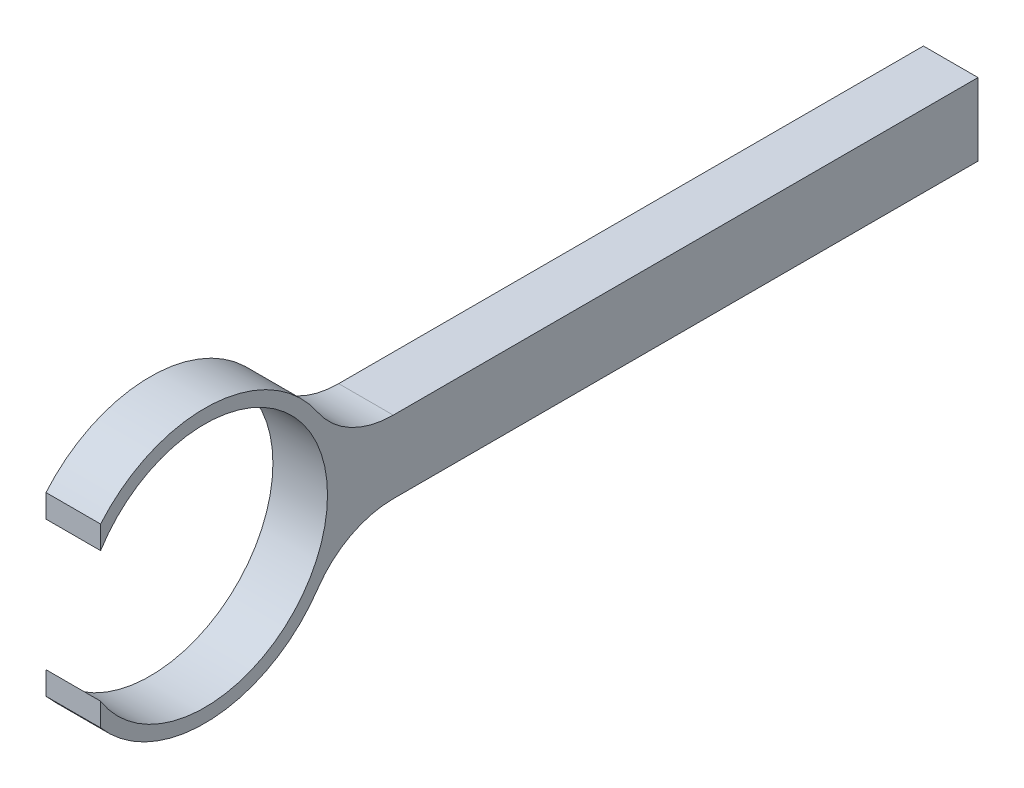
ISO-10303-21;
HEADER;
FILE_DESCRIPTION(('STEP AP214'),'2;1');
FILE_NAME('part.step','',(''),(''),'','','');
FILE_SCHEMA(('AUTOMOTIVE_DESIGN { 1 0 10303 214 1 1 1 1 }'));
ENDSEC;
DATA;
#1=APPLICATION_CONTEXT('core data for automotive mechanical design processes');
#2=APPLICATION_PROTOCOL_DEFINITION('international standard','automotive_design',2000,#1);
#3=PRODUCT_CONTEXT('',#1,'mechanical');
#4=PRODUCT('Part','Part','',(#3));
#5=PRODUCT_RELATED_PRODUCT_CATEGORY('part','',(#4));
#6=PRODUCT_DEFINITION_FORMATION('','',#4);
#7=PRODUCT_DEFINITION_CONTEXT('part definition',#1,'design');
#8=PRODUCT_DEFINITION('design','',#6,#7);
#9=PRODUCT_DEFINITION_SHAPE('','',#8);
#10=(LENGTH_UNIT() NAMED_UNIT(*) SI_UNIT(.MILLI.,.METRE.));
#11=(NAMED_UNIT(*) PLANE_ANGLE_UNIT() SI_UNIT($,.RADIAN.));
#12=(NAMED_UNIT(*) SI_UNIT($,.STERADIAN.) SOLID_ANGLE_UNIT());
#13=UNCERTAINTY_MEASURE_WITH_UNIT(LENGTH_MEASURE(1.E-05),#10,'distance_accuracy_value','');
#14=(GEOMETRIC_REPRESENTATION_CONTEXT(3) GLOBAL_UNCERTAINTY_ASSIGNED_CONTEXT((#13)) GLOBAL_UNIT_ASSIGNED_CONTEXT((#10,
#11,#12)) REPRESENTATION_CONTEXT('',''));
#15=CARTESIAN_POINT('',(0.,0.,0.));
#16=DIRECTION('',(0.,0.,1.));
#17=DIRECTION('',(1.,0.,0.));
#18=AXIS2_PLACEMENT_3D('',#15,#16,#17);
#19=CARTESIAN_POINT('',(6.,0.,0.));
#20=DIRECTION('',(-1.,0.,0.));
#21=DIRECTION('',(0.,0.,1.));
#22=AXIS2_PLACEMENT_3D('',#19,#20,#21);
#23=CYLINDRICAL_SURFACE('',#22,13.5);
#24=CARTESIAN_POINT('',(0.,0.,0.));
#25=DIRECTION('',(1.,0.,0.));
#26=DIRECTION('',(0.,0.,-1.));
#27=AXIS2_PLACEMENT_3D('',#24,#25,#26);
#28=CIRCLE('',#27,13.5);
#29=CARTESIAN_POINT('',(0.,-7.16348225812186,11.442662362299));
#30=VERTEX_POINT('',#29);
#31=CARTESIAN_POINT('',(0.,7.16348225812186,11.442662362299));
#32=VERTEX_POINT('',#31);
#33=EDGE_CURVE('E117',#30,#32,#28,.T.);
#34=ORIENTED_EDGE('',*,*,#33,.F.);
#35=DIRECTION('',(-1.,0.,0.));
#36=VECTOR('',#35,1.);
#37=CARTESIAN_POINT('',(6.,-7.16348225812186,11.442662362299));
#38=LINE('',#37,#36);
#39=CARTESIAN_POINT('',(6.,-7.16348225812186,11.442662362299));
#40=VERTEX_POINT('',#39);
#41=EDGE_CURVE('E112',#40,#30,#38,.T.);
#42=ORIENTED_EDGE('',*,*,#41,.F.);
#43=CARTESIAN_POINT('',(6.,0.,0.));
#44=DIRECTION('',(1.,0.,0.));
#45=DIRECTION('',(0.,0.,-1.));
#46=AXIS2_PLACEMENT_3D('',#43,#44,#45);
#47=CIRCLE('',#46,13.5);
#48=CARTESIAN_POINT('',(6.,7.16348225812186,11.442662362299));
#49=VERTEX_POINT('',#48);
#50=EDGE_CURVE('E115',#40,#49,#47,.T.);
#51=ORIENTED_EDGE('',*,*,#50,.T.);
#52=DIRECTION('',(-1.,0.,0.));
#53=VECTOR('',#52,1.);
#54=CARTESIAN_POINT('',(6.,7.16348225812186,11.442662362299));
#55=LINE('',#54,#53);
#56=EDGE_CURVE('E160',#49,#32,#55,.T.);
#57=ORIENTED_EDGE('',*,*,#56,.T.);
#58=EDGE_LOOP('',(#34,#42,#51,#57));
#59=FACE_BOUND('',#58,.T.);
#60=ADVANCED_FACE('F35',(#59),#23,.F.);
#61=CARTESIAN_POINT('',(6.,0.,11.442662362299));
#62=DIRECTION('',(0.,0.,-1.));
#63=DIRECTION('',(0.,1.,0.));
#64=AXIS2_PLACEMENT_3D('',#61,#62,#63);
#65=PLANE('',#64);
#66=DIRECTION('',(0.,-1.,0.));
#67=VECTOR('',#66,1.);
#68=CARTESIAN_POINT('',(0.,0.,11.442662362299));
#69=LINE('',#68,#67);
#70=CARTESIAN_POINT('',(0.,-9.69873590023085,11.442662362299));
#71=VERTEX_POINT('',#70);
#72=EDGE_CURVE('E139',#30,#71,#69,.T.);
#73=ORIENTED_EDGE('',*,*,#72,.T.);
#74=DIRECTION('',(-1.,0.,0.));
#75=VECTOR('',#74,1.);
#76=CARTESIAN_POINT('',(6.,-9.69873590023085,11.442662362299));
#77=LINE('',#76,#75);
#78=CARTESIAN_POINT('',(6.,-9.69873590023085,11.442662362299));
#79=VERTEX_POINT('',#78);
#80=EDGE_CURVE('E121',#79,#71,#77,.T.);
#81=ORIENTED_EDGE('',*,*,#80,.F.);
#82=DIRECTION('',(0.,-1.,0.));
#83=VECTOR('',#82,1.);
#84=CARTESIAN_POINT('',(6.,0.,11.442662362299));
#85=LINE('',#84,#83);
#86=EDGE_CURVE('E124',#40,#79,#85,.T.);
#87=ORIENTED_EDGE('',*,*,#86,.F.);
#88=ORIENTED_EDGE('',*,*,#41,.T.);
#89=EDGE_LOOP('',(#73,#81,#87,#88));
#90=FACE_BOUND('',#89,.T.);
#91=ADVANCED_FACE('F125',(#90),#65,.F.);
#92=CARTESIAN_POINT('',(6.,0.,0.));
#93=DIRECTION('',(-1.,0.,0.));
#94=DIRECTION('',(0.,0.,1.));
#95=AXIS2_PLACEMENT_3D('',#92,#93,#94);
#96=CYLINDRICAL_SURFACE('',#95,15.);
#97=CARTESIAN_POINT('',(0.,0.,0.));
#98=DIRECTION('',(1.,0.,0.));
#99=DIRECTION('',(0.,0.,-1.));
#100=AXIS2_PLACEMENT_3D('',#97,#98,#99);
#101=CIRCLE('',#100,15.);
#102=CARTESIAN_POINT('',(0.,-8.3880894821815,-12.435431429545));
#103=VERTEX_POINT('',#102);
#104=EDGE_CURVE('E151',#71,#103,#101,.T.);
#105=ORIENTED_EDGE('',*,*,#104,.T.);
#106=DIRECTION('',(-1.,0.,0.));
#107=VECTOR('',#106,1.);
#108=CARTESIAN_POINT('',(6.,-8.3880894821815,-12.435431429545));
#109=LINE('',#108,#107);
#110=CARTESIAN_POINT('',(6.,-8.3880894821815,-12.435431429545));
#111=VERTEX_POINT('',#110);
#112=EDGE_CURVE('E50',#103,#111,#109,.F.);
#113=ORIENTED_EDGE('',*,*,#112,.T.);
#114=CARTESIAN_POINT('',(6.,0.,0.));
#115=DIRECTION('',(1.,0.,0.));
#116=DIRECTION('',(0.,0.,-1.));
#117=AXIS2_PLACEMENT_3D('',#114,#115,#116);
#118=CIRCLE('',#117,15.);
#119=EDGE_CURVE('E128',#79,#111,#118,.T.);
#120=ORIENTED_EDGE('',*,*,#119,.F.);
#121=ORIENTED_EDGE('',*,*,#80,.T.);
#122=EDGE_LOOP('',(#105,#113,#120,#121));
#123=FACE_BOUND('',#122,.T.);
#124=ADVANCED_FACE('F211',(#123),#96,.T.);
#125=CARTESIAN_POINT('',(6.,-3.98014913696917,0.));
#126=DIRECTION('',(0.,1.,0.));
#127=DIRECTION('',(0.,0.,1.));
#128=AXIS2_PLACEMENT_3D('',#125,#126,#127);
#129=PLANE('',#128);
#130=DIRECTION('',(0.,0.,-1.));
#131=VECTOR('',#130,1.);
#132=CARTESIAN_POINT('',(6.,-3.98014913696917,0.));
#133=LINE('',#132,#131);
#134=CARTESIAN_POINT('',(6.,-3.98014913696917,-20.7257190492417));
#135=VERTEX_POINT('',#134);
#136=CARTESIAN_POINT('',(6.,-3.98014913696917,-85.));
#137=VERTEX_POINT('',#136);
#138=EDGE_CURVE('E142',#135,#137,#133,.T.);
#139=ORIENTED_EDGE('',*,*,#138,.F.);
#140=DIRECTION('',(1.,0.,0.));
#141=VECTOR('',#140,1.);
#142=CARTESIAN_POINT('',(0.,-3.98014913696917,-20.7257190492417));
#143=LINE('',#142,#141);
#144=CARTESIAN_POINT('',(0.,-3.98014913696917,-20.7257190492417));
#145=VERTEX_POINT('',#144);
#146=EDGE_CURVE('E176',#135,#145,#143,.F.);
#147=ORIENTED_EDGE('',*,*,#146,.T.);
#148=DIRECTION('',(0.,0.,-1.));
#149=VECTOR('',#148,1.);
#150=CARTESIAN_POINT('',(0.,-3.98014913696917,0.));
#151=LINE('',#150,#149);
#152=CARTESIAN_POINT('',(0.,-3.98014913696917,-85.));
#153=VERTEX_POINT('',#152);
#154=EDGE_CURVE('E153',#145,#153,#151,.T.);
#155=ORIENTED_EDGE('',*,*,#154,.T.);
#156=DIRECTION('',(-1.,0.,0.));
#157=VECTOR('',#156,1.);
#158=CARTESIAN_POINT('',(6.,-3.98014913696917,-85.));
#159=LINE('',#158,#157);
#160=EDGE_CURVE('E168',#137,#153,#159,.T.);
#161=ORIENTED_EDGE('',*,*,#160,.F.);
#162=EDGE_LOOP('',(#139,#147,#155,#161));
#163=FACE_BOUND('',#162,.T.);
#164=ADVANCED_FACE('F207',(#163),#129,.F.);
#165=CARTESIAN_POINT('',(6.,0.,-85.));
#166=DIRECTION('',(0.,0.,1.));
#167=DIRECTION('',(1.,0.,0.));
#168=AXIS2_PLACEMENT_3D('',#165,#166,#167);
#169=PLANE('',#168);
#170=DIRECTION('',(0.,1.,0.));
#171=VECTOR('',#170,1.);
#172=CARTESIAN_POINT('',(0.,0.,-85.));
#173=LINE('',#172,#171);
#174=CARTESIAN_POINT('',(0.,3.98014913696917,-85.));
#175=VERTEX_POINT('',#174);
#176=EDGE_CURVE('E155',#153,#175,#173,.T.);
#177=ORIENTED_EDGE('',*,*,#176,.T.);
#178=DIRECTION('',(-1.,0.,0.));
#179=VECTOR('',#178,1.);
#180=CARTESIAN_POINT('',(6.,3.98014913696917,-85.));
#181=LINE('',#180,#179);
#182=CARTESIAN_POINT('',(6.,3.98014913696917,-85.));
#183=VERTEX_POINT('',#182);
#184=EDGE_CURVE('E165',#183,#175,#181,.T.);
#185=ORIENTED_EDGE('',*,*,#184,.F.);
#186=DIRECTION('',(0.,1.,0.));
#187=VECTOR('',#186,1.);
#188=CARTESIAN_POINT('',(6.,0.,-85.));
#189=LINE('',#188,#187);
#190=EDGE_CURVE('E145',#137,#183,#189,.T.);
#191=ORIENTED_EDGE('',*,*,#190,.F.);
#192=ORIENTED_EDGE('',*,*,#160,.T.);
#193=EDGE_LOOP('',(#177,#185,#191,#192));
#194=FACE_BOUND('',#193,.T.);
#195=ADVANCED_FACE('F203',(#194),#169,.F.);
#196=CARTESIAN_POINT('',(6.,3.98014913696917,0.));
#197=DIRECTION('',(0.,1.,0.));
#198=DIRECTION('',(0.,0.,1.));
#199=AXIS2_PLACEMENT_3D('',#196,#197,#198);
#200=PLANE('',#199);
#201=DIRECTION('',(0.,0.,-1.));
#202=VECTOR('',#201,1.);
#203=CARTESIAN_POINT('',(0.,3.98014913696917,0.));
#204=LINE('',#203,#202);
#205=CARTESIAN_POINT('',(0.,3.98014913696917,-20.7257190492417));
#206=VERTEX_POINT('',#205);
#207=EDGE_CURVE('E158',#206,#175,#204,.T.);
#208=ORIENTED_EDGE('',*,*,#207,.F.);
#209=DIRECTION('',(-1.,0.,0.));
#210=VECTOR('',#209,1.);
#211=CARTESIAN_POINT('',(6.,3.98014913696917,-20.7257190492417));
#212=LINE('',#211,#210);
#213=CARTESIAN_POINT('',(6.,3.98014913696917,-20.7257190492417));
#214=VERTEX_POINT('',#213);
#215=EDGE_CURVE('E174',#206,#214,#212,.F.);
#216=ORIENTED_EDGE('',*,*,#215,.T.);
#217=DIRECTION('',(0.,0.,-1.));
#218=VECTOR('',#217,1.);
#219=CARTESIAN_POINT('',(6.,3.98014913696917,0.));
#220=LINE('',#219,#218);
#221=EDGE_CURVE('E148',#214,#183,#220,.T.);
#222=ORIENTED_EDGE('',*,*,#221,.T.);
#223=ORIENTED_EDGE('',*,*,#184,.T.);
#224=EDGE_LOOP('',(#208,#216,#222,#223));
#225=FACE_BOUND('',#224,.T.);
#226=ADVANCED_FACE('F199',(#225),#200,.T.);
#227=CARTESIAN_POINT('',(6.,8.3880894821815,-12.435431429545));
#228=VERTEX_POINT('',#227);
#229=CARTESIAN_POINT('',(6.,9.69873590023085,11.442662362299));
#230=VERTEX_POINT('',#229);
#231=EDGE_CURVE('E143',#228,#230,#118,.T.);
#232=ORIENTED_EDGE('',*,*,#231,.F.);
#233=DIRECTION('',(-1.,0.,0.));
#234=VECTOR('',#233,1.);
#235=CARTESIAN_POINT('',(6.,8.3880894821815,-12.435431429545));
#236=LINE('',#235,#234);
#237=CARTESIAN_POINT('',(0.,8.3880894821815,-12.435431429545));
#238=VERTEX_POINT('',#237);
#239=EDGE_CURVE('E120',#228,#238,#236,.T.);
#240=ORIENTED_EDGE('',*,*,#239,.T.);
#241=CARTESIAN_POINT('',(0.,9.69873590023085,11.442662362299));
#242=VERTEX_POINT('',#241);
#243=EDGE_CURVE('E137',#238,#242,#101,.T.);
#244=ORIENTED_EDGE('',*,*,#243,.T.);
#245=DIRECTION('',(-1.,0.,0.));
#246=VECTOR('',#245,1.);
#247=CARTESIAN_POINT('',(6.,9.69873590023085,11.442662362299));
#248=LINE('',#247,#246);
#249=EDGE_CURVE('E162',#230,#242,#248,.T.);
#250=ORIENTED_EDGE('',*,*,#249,.F.);
#251=EDGE_LOOP('',(#232,#240,#244,#250));
#252=FACE_BOUND('',#251,.T.);
#253=ADVANCED_FACE('F191',(#252),#96,.T.);
#254=EDGE_CURVE('E134',#242,#32,#69,.T.);
#255=ORIENTED_EDGE('',*,*,#254,.T.);
#256=ORIENTED_EDGE('',*,*,#56,.F.);
#257=EDGE_CURVE('E130',#230,#49,#85,.T.);
#258=ORIENTED_EDGE('',*,*,#257,.F.);
#259=ORIENTED_EDGE('',*,*,#249,.T.);
#260=EDGE_LOOP('',(#255,#256,#258,#259));
#261=FACE_BOUND('',#260,.T.);
#262=ADVANCED_FACE('F213',(#261),#65,.F.);
#263=CARTESIAN_POINT('',(6.,0.,0.));
#264=DIRECTION('',(1.,0.,0.));
#265=DIRECTION('',(0.,0.,-1.));
#266=AXIS2_PLACEMENT_3D('',#263,#264,#265);
#267=PLANE('',#266);
#268=ORIENTED_EDGE('',*,*,#50,.F.);
#269=ORIENTED_EDGE('',*,*,#86,.T.);
#270=ORIENTED_EDGE('',*,*,#119,.T.);
#271=CARTESIAN_POINT('',(6.,-13.9801491369692,-20.7257190492417));
#272=DIRECTION('',(1.,0.,0.));
#273=DIRECTION('',(0.,0.,-1.));
#274=AXIS2_PLACEMENT_3D('',#271,#272,#273);
#275=CIRCLE('',#274,10.);
#276=EDGE_CURVE('E11',#111,#135,#275,.F.);
#277=ORIENTED_EDGE('',*,*,#276,.T.);
#278=ORIENTED_EDGE('',*,*,#138,.T.);
#279=ORIENTED_EDGE('',*,*,#190,.T.);
#280=ORIENTED_EDGE('',*,*,#221,.F.);
#281=CARTESIAN_POINT('',(6.,13.9801491369692,-20.7257190492417));
#282=DIRECTION('',(1.,0.,0.));
#283=DIRECTION('',(0.,0.,-1.));
#284=AXIS2_PLACEMENT_3D('',#281,#282,#283);
#285=CIRCLE('',#284,10.);
#286=EDGE_CURVE('E182',#214,#228,#285,.F.);
#287=ORIENTED_EDGE('',*,*,#286,.T.);
#288=ORIENTED_EDGE('',*,*,#231,.T.);
#289=ORIENTED_EDGE('',*,*,#257,.T.);
#290=EDGE_LOOP('',(#268,#269,#270,#277,#278,#279,#280,#287,#288,#289));
#291=FACE_BOUND('',#290,.T.);
#292=ADVANCED_FACE('F131',(#291),#267,.T.);
#293=CARTESIAN_POINT('',(0.,0.,0.));
#294=DIRECTION('',(1.,0.,0.));
#295=DIRECTION('',(0.,0.,-1.));
#296=AXIS2_PLACEMENT_3D('',#293,#294,#295);
#297=PLANE('',#296);
#298=ORIENTED_EDGE('',*,*,#33,.T.);
#299=ORIENTED_EDGE('',*,*,#254,.F.);
#300=ORIENTED_EDGE('',*,*,#243,.F.);
#301=CARTESIAN_POINT('',(0.,13.9801491369692,-20.7257190492417));
#302=DIRECTION('',(1.,0.,0.));
#303=DIRECTION('',(0.,0.,-1.));
#304=AXIS2_PLACEMENT_3D('',#301,#302,#303);
#305=CIRCLE('',#304,10.);
#306=EDGE_CURVE('E180',#238,#206,#305,.T.);
#307=ORIENTED_EDGE('',*,*,#306,.T.);
#308=ORIENTED_EDGE('',*,*,#207,.T.);
#309=ORIENTED_EDGE('',*,*,#176,.F.);
#310=ORIENTED_EDGE('',*,*,#154,.F.);
#311=CARTESIAN_POINT('',(0.,-13.9801491369692,-20.7257190492417));
#312=DIRECTION('',(1.,0.,0.));
#313=DIRECTION('',(0.,0.,-1.));
#314=AXIS2_PLACEMENT_3D('',#311,#312,#313);
#315=CIRCLE('',#314,10.);
#316=EDGE_CURVE('E43',#145,#103,#315,.T.);
#317=ORIENTED_EDGE('',*,*,#316,.T.);
#318=ORIENTED_EDGE('',*,*,#104,.F.);
#319=ORIENTED_EDGE('',*,*,#72,.F.);
#320=EDGE_LOOP('',(#298,#299,#300,#307,#308,#309,#310,#317,#318,#319));
#321=FACE_BOUND('',#320,.T.);
#322=ADVANCED_FACE('F195',(#321),#297,.F.);
#323=CARTESIAN_POINT('',(6.,13.9801491369692,-20.7257190492417));
#324=DIRECTION('',(-1.,0.,0.));
#325=DIRECTION('',(0.,0.,1.));
#326=AXIS2_PLACEMENT_3D('',#323,#324,#325);
#327=CYLINDRICAL_SURFACE('',#326,10.);
#328=ORIENTED_EDGE('',*,*,#286,.F.);
#329=ORIENTED_EDGE('',*,*,#215,.F.);
#330=ORIENTED_EDGE('',*,*,#306,.F.);
#331=ORIENTED_EDGE('',*,*,#239,.F.);
#332=EDGE_LOOP('',(#328,#329,#330,#331));
#333=FACE_BOUND('',#332,.T.);
#334=ADVANCED_FACE('F193',(#333),#327,.F.);
#335=CARTESIAN_POINT('',(6.,-13.9801491369692,-20.7257190492417));
#336=DIRECTION('',(-1.,0.,0.));
#337=DIRECTION('',(0.,0.,1.));
#338=AXIS2_PLACEMENT_3D('',#335,#336,#337);
#339=CYLINDRICAL_SURFACE('',#338,10.);
#340=ORIENTED_EDGE('',*,*,#276,.F.);
#341=ORIENTED_EDGE('',*,*,#112,.F.);
#342=ORIENTED_EDGE('',*,*,#316,.F.);
#343=ORIENTED_EDGE('',*,*,#146,.F.);
#344=EDGE_LOOP('',(#340,#341,#342,#343));
#345=FACE_BOUND('',#344,.T.);
#346=ADVANCED_FACE('F37',(#345),#339,.F.);
#347=CLOSED_SHELL('',(#60,#91,#124,#164,#195,#226,#253,#262,#292,#322,#334,#346));
#348=MANIFOLD_SOLID_BREP('B2',#347);
#349=ADVANCED_BREP_SHAPE_REPRESENTATION('',(#18,#348),#14);
#350=SHAPE_DEFINITION_REPRESENTATION(#9,#349);
ENDSEC;
END-ISO-10303-21;
